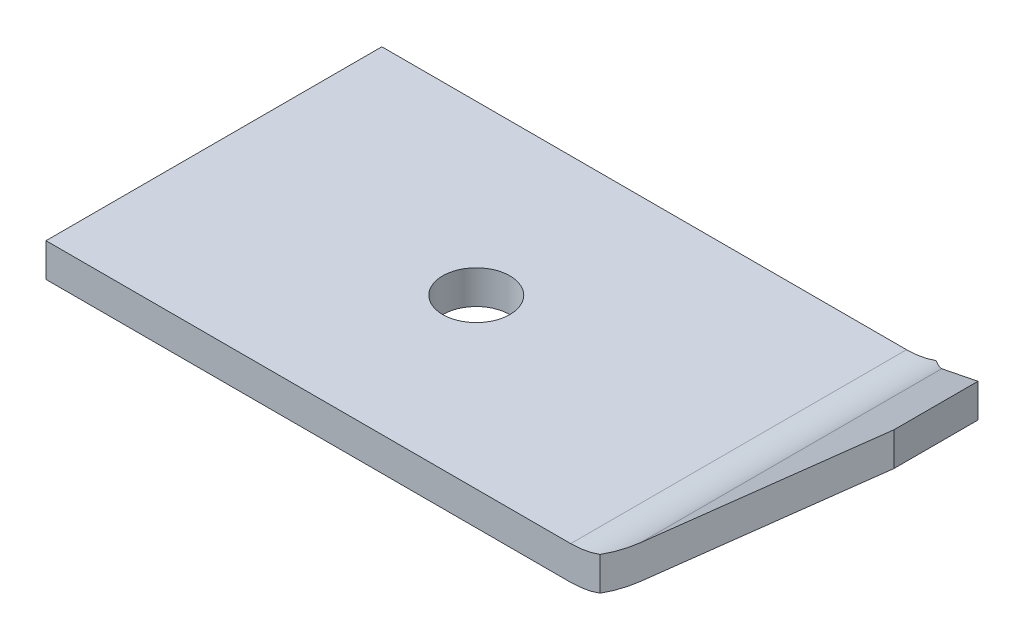
ISO-10303-21;
HEADER;
FILE_DESCRIPTION(('STEP AP214'),'2;1');
FILE_NAME('part.step','',(''),(''),'','','');
FILE_SCHEMA(('AUTOMOTIVE_DESIGN { 1 0 10303 214 1 1 1 1 }'));
ENDSEC;
DATA;
#1=APPLICATION_CONTEXT('core data for automotive mechanical design processes');
#2=APPLICATION_PROTOCOL_DEFINITION('international standard','automotive_design',2000,#1);
#3=PRODUCT_CONTEXT('',#1,'mechanical');
#4=PRODUCT('Part','Part','',(#3));
#5=PRODUCT_RELATED_PRODUCT_CATEGORY('part','',(#4));
#6=PRODUCT_DEFINITION_FORMATION('','',#4);
#7=PRODUCT_DEFINITION_CONTEXT('part definition',#1,'design');
#8=PRODUCT_DEFINITION('design','',#6,#7);
#9=PRODUCT_DEFINITION_SHAPE('','',#8);
#10=(LENGTH_UNIT() NAMED_UNIT(*) SI_UNIT(.MILLI.,.METRE.));
#11=(NAMED_UNIT(*) PLANE_ANGLE_UNIT() SI_UNIT($,.RADIAN.));
#12=(NAMED_UNIT(*) SI_UNIT($,.STERADIAN.) SOLID_ANGLE_UNIT());
#13=UNCERTAINTY_MEASURE_WITH_UNIT(LENGTH_MEASURE(1.E-05),#10,'distance_accuracy_value','');
#14=(GEOMETRIC_REPRESENTATION_CONTEXT(3) GLOBAL_UNCERTAINTY_ASSIGNED_CONTEXT((#13)) GLOBAL_UNIT_ASSIGNED_CONTEXT((#10,
#11,#12)) REPRESENTATION_CONTEXT('',''));
#15=CARTESIAN_POINT('',(0.,0.,0.));
#16=DIRECTION('',(0.,0.,1.));
#17=DIRECTION('',(1.,0.,0.));
#18=AXIS2_PLACEMENT_3D('',#15,#16,#17);
#19=CARTESIAN_POINT('',(16.5,5.,0.));
#20=DIRECTION('',(0.,0.,-1.));
#21=DIRECTION('',(-1.,0.,0.));
#22=AXIS2_PLACEMENT_3D('',#19,#20,#21);
#23=PLANE('',#22);
#24=DIRECTION('',(-1.,0.,0.));
#25=VECTOR('',#24,1.);
#26=CARTESIAN_POINT('',(0.,1.,0.));
#27=LINE('',#26,#25);
#28=CARTESIAN_POINT('',(15.6230473516045,1.,0.));
#29=VERTEX_POINT('',#28);
#30=CARTESIAN_POINT('',(0.,1.,0.));
#31=VERTEX_POINT('',#30);
#32=EDGE_CURVE('E142',#29,#31,#27,.T.);
#33=ORIENTED_EDGE('',*,*,#32,.T.);
#34=DIRECTION('',(0.,-1.,0.));
#35=VECTOR('',#34,1.);
#36=CARTESIAN_POINT('',(0.,5.,0.));
#37=LINE('',#36,#35);
#38=CARTESIAN_POINT('',(0.,0.,0.));
#39=VERTEX_POINT('',#38);
#40=EDGE_CURVE('E154',#31,#39,#37,.T.);
#41=ORIENTED_EDGE('',*,*,#40,.T.);
#42=DIRECTION('',(1.,0.,0.));
#43=VECTOR('',#42,1.);
#44=CARTESIAN_POINT('',(16.5,0.,0.));
#45=LINE('',#44,#43);
#46=CARTESIAN_POINT('',(15.6230473516045,0.,0.));
#47=VERTEX_POINT('',#46);
#48=EDGE_CURVE('E146',#39,#47,#45,.T.);
#49=ORIENTED_EDGE('',*,*,#48,.T.);
#50=CARTESIAN_POINT('',(15.6230473516045,2.5,0.));
#51=DIRECTION('',(0.,0.,1.));
#52=DIRECTION('',(-1.,0.,0.));
#53=AXIS2_PLACEMENT_3D('',#50,#51,#52);
#54=CIRCLE('',#53,2.5);
#55=CARTESIAN_POINT('',(16.5,0.158856251215644,0.));
#56=VERTEX_POINT('',#55);
#57=EDGE_CURVE('E49',#47,#56,#54,.T.);
#58=ORIENTED_EDGE('',*,*,#57,.T.);
#59=DIRECTION('',(0.,-1.,0.));
#60=VECTOR('',#59,1.);
#61=CARTESIAN_POINT('',(16.5,5.,0.));
#62=LINE('',#61,#60);
#63=CARTESIAN_POINT('',(16.5,1.15885625121564,0.));
#64=VERTEX_POINT('',#63);
#65=EDGE_CURVE('E42',#64,#56,#62,.T.);
#66=ORIENTED_EDGE('',*,*,#65,.F.);
#67=CARTESIAN_POINT('',(15.6230473516045,3.5,0.));
#68=DIRECTION('',(0.,0.,-1.));
#69=DIRECTION('',(1.,0.,0.));
#70=AXIS2_PLACEMENT_3D('',#67,#68,#69);
#71=CIRCLE('',#70,2.5);
#72=EDGE_CURVE('E173',#64,#29,#71,.T.);
#73=ORIENTED_EDGE('',*,*,#72,.T.);
#74=EDGE_LOOP('',(#33,#41,#49,#58,#66,#73));
#75=FACE_BOUND('',#74,.T.);
#76=ADVANCED_FACE('F35',(#75),#23,.F.);
#77=CARTESIAN_POINT('',(21.5,5.,-3.75));
#78=DIRECTION('',(-0.6,0.,-0.8));
#79=DIRECTION('',(-0.8,0.,0.6));
#80=AXIS2_PLACEMENT_3D('',#77,#78,#79);
#81=PLANE('',#80);
#82=CARTESIAN_POINT('',(15.6230473516045,3.5,0.657714486296647));
#83=DIRECTION('',(-0.6,0.,-0.8));
#84=DIRECTION('',(-0.8,0.,0.6));
#85=AXIS2_PLACEMENT_3D('',#82,#83,#84);
#86=ELLIPSE('',#85,3.125,2.5);
#87=CARTESIAN_POINT('',(17.1847849704905,1.54782797639243,-0.513588727867904));
#88=VERTEX_POINT('',#87);
#89=EDGE_CURVE('E79',#64,#88,#86,.F.);
#90=ORIENTED_EDGE('',*,*,#89,.F.);
#91=ORIENTED_EDGE('',*,*,#65,.T.);
#92=CARTESIAN_POINT('',(15.6230473516045,2.5,0.657714486296647));
#93=DIRECTION('',(-0.6,0.,-0.8));
#94=DIRECTION('',(-0.8,0.,0.6));
#95=AXIS2_PLACEMENT_3D('',#92,#93,#94);
#96=ELLIPSE('',#95,3.125,2.5);
#97=CARTESIAN_POINT('',(17.1847849704905,0.547827976392431,-0.513588727867904));
#98=VERTEX_POINT('',#97);
#99=EDGE_CURVE('E169',#98,#56,#96,.T.);
#100=ORIENTED_EDGE('',*,*,#99,.F.);
#101=DIRECTION('',(-0.673817120529209,-0.539053696423368,0.505362840396907));
#102=VECTOR('',#101,1.);
#103=CARTESIAN_POINT('',(21.8632236095346,4.2905788876277,-4.02241770715096));
#104=LINE('',#103,#102);
#105=CARTESIAN_POINT('',(21.5,4.,-3.75));
#106=VERTEX_POINT('',#105);
#107=EDGE_CURVE('E150',#106,#98,#104,.T.);
#108=ORIENTED_EDGE('',*,*,#107,.F.);
#109=DIRECTION('',(0.,-1.,0.));
#110=VECTOR('',#109,1.);
#111=CARTESIAN_POINT('',(21.5,5.,-3.75));
#112=LINE('',#111,#110);
#113=CARTESIAN_POINT('',(21.5,5.,-3.75));
#114=VERTEX_POINT('',#113);
#115=EDGE_CURVE('E161',#114,#106,#112,.T.);
#116=ORIENTED_EDGE('',*,*,#115,.F.);
#117=DIRECTION('',(0.673817120529209,0.539053696423368,-0.505362840396907));
#118=VECTOR('',#117,1.);
#119=CARTESIAN_POINT('',(21.5,5.,-3.75));
#120=LINE('',#119,#118);
#121=EDGE_CURVE('E58',#88,#114,#120,.T.);
#122=ORIENTED_EDGE('',*,*,#121,.F.);
#123=EDGE_LOOP('',(#90,#91,#100,#108,#116,#122));
#124=FACE_BOUND('',#123,.T.);
#125=ADVANCED_FACE('F167',(#124),#81,.F.);
#126=CARTESIAN_POINT('',(21.5,5.,-6.25));
#127=DIRECTION('',(-1.,0.,0.));
#128=DIRECTION('',(0.,0.,1.));
#129=AXIS2_PLACEMENT_3D('',#126,#127,#128);
#130=PLANE('',#129);
#131=DIRECTION('',(0.,0.,1.));
#132=VECTOR('',#131,1.);
#133=CARTESIAN_POINT('',(21.5,4.,-10.));
#134=LINE('',#133,#132);
#135=CARTESIAN_POINT('',(21.5,4.,-6.25));
#136=VERTEX_POINT('',#135);
#137=EDGE_CURVE('E191',#136,#106,#134,.T.);
#138=ORIENTED_EDGE('',*,*,#137,.F.);
#139=DIRECTION('',(0.,-1.,0.));
#140=VECTOR('',#139,1.);
#141=CARTESIAN_POINT('',(21.5,5.,-6.25));
#142=LINE('',#141,#140);
#143=CARTESIAN_POINT('',(21.5,5.,-6.25));
#144=VERTEX_POINT('',#143);
#145=EDGE_CURVE('E158',#144,#136,#142,.T.);
#146=ORIENTED_EDGE('',*,*,#145,.F.);
#147=DIRECTION('',(0.,0.,-1.));
#148=VECTOR('',#147,1.);
#149=CARTESIAN_POINT('',(21.5,5.,-6.25));
#150=LINE('',#149,#148);
#151=EDGE_CURVE('E148',#114,#144,#150,.T.);
#152=ORIENTED_EDGE('',*,*,#151,.F.);
#153=ORIENTED_EDGE('',*,*,#115,.T.);
#154=EDGE_LOOP('',(#138,#146,#152,#153));
#155=FACE_BOUND('',#154,.T.);
#156=ADVANCED_FACE('F211',(#155),#130,.F.);
#157=CARTESIAN_POINT('',(16.5,5.,-10.));
#158=DIRECTION('',(-0.600000000000001,0.,0.8));
#159=DIRECTION('',(0.8,0.,0.600000000000001));
#160=AXIS2_PLACEMENT_3D('',#157,#158,#159);
#161=PLANE('',#160);
#162=CARTESIAN_POINT('',(15.6230473516045,3.5,-10.6577144862966));
#163=DIRECTION('',(-0.600000000000001,0.,0.8));
#164=DIRECTION('',(0.8,0.,0.600000000000001));
#165=AXIS2_PLACEMENT_3D('',#162,#163,#164);
#166=ELLIPSE('',#165,3.125,2.5);
#167=CARTESIAN_POINT('',(17.1847849704905,1.54782797639243,-9.4864112721321));
#168=VERTEX_POINT('',#167);
#169=CARTESIAN_POINT('',(16.5,1.15885625121564,-10.));
#170=VERTEX_POINT('',#169);
#171=EDGE_CURVE('E199',#168,#170,#166,.F.);
#172=ORIENTED_EDGE('',*,*,#171,.F.);
#173=DIRECTION('',(-0.673817120529209,-0.539053696423367,-0.505362840396907));
#174=VECTOR('',#173,1.);
#175=CARTESIAN_POINT('',(17.9528944381385,2.16231555051078,-8.91032917139614));
#176=LINE('',#175,#174);
#177=EDGE_CURVE('E83',#144,#168,#176,.T.);
#178=ORIENTED_EDGE('',*,*,#177,.F.);
#179=ORIENTED_EDGE('',*,*,#145,.T.);
#180=DIRECTION('',(0.673817120529209,0.539053696423367,0.505362840396907));
#181=VECTOR('',#180,1.);
#182=CARTESIAN_POINT('',(18.3161180476731,1.45289443813848,-8.63791146424517));
#183=LINE('',#182,#181);
#184=CARTESIAN_POINT('',(17.1847849704905,0.547827976392431,-9.4864112721321));
#185=VERTEX_POINT('',#184);
#186=EDGE_CURVE('E11',#185,#136,#183,.T.);
#187=ORIENTED_EDGE('',*,*,#186,.F.);
#188=CARTESIAN_POINT('',(15.6230473516045,2.5,-10.6577144862966));
#189=DIRECTION('',(-0.600000000000001,0.,0.8));
#190=DIRECTION('',(0.8,0.,0.600000000000001));
#191=AXIS2_PLACEMENT_3D('',#188,#189,#190);
#192=ELLIPSE('',#191,3.125,2.5);
#193=CARTESIAN_POINT('',(16.5,0.158856251215644,-10.));
#194=VERTEX_POINT('',#193);
#195=EDGE_CURVE('E186',#194,#185,#192,.T.);
#196=ORIENTED_EDGE('',*,*,#195,.F.);
#197=DIRECTION('',(0.,-1.,0.));
#198=VECTOR('',#197,1.);
#199=CARTESIAN_POINT('',(16.5,5.,-10.));
#200=LINE('',#199,#198);
#201=EDGE_CURVE('E140',#170,#194,#200,.T.);
#202=ORIENTED_EDGE('',*,*,#201,.F.);
#203=EDGE_LOOP('',(#172,#178,#179,#187,#196,#202));
#204=FACE_BOUND('',#203,.T.);
#205=ADVANCED_FACE('F208',(#204),#161,.F.);
#206=CARTESIAN_POINT('',(0.,5.,-10.));
#207=DIRECTION('',(0.,0.,1.));
#208=DIRECTION('',(1.,0.,0.));
#209=AXIS2_PLACEMENT_3D('',#206,#207,#208);
#210=PLANE('',#209);
#211=DIRECTION('',(-1.,0.,0.));
#212=VECTOR('',#211,1.);
#213=CARTESIAN_POINT('',(0.,1.,-10.));
#214=LINE('',#213,#212);
#215=CARTESIAN_POINT('',(15.6230473516045,1.,-10.));
#216=VERTEX_POINT('',#215);
#217=CARTESIAN_POINT('',(0.,1.,-10.));
#218=VERTEX_POINT('',#217);
#219=EDGE_CURVE('E130',#216,#218,#214,.T.);
#220=ORIENTED_EDGE('',*,*,#219,.F.);
#221=CARTESIAN_POINT('',(15.6230473516045,3.5,-10.));
#222=DIRECTION('',(0.,0.,-1.));
#223=DIRECTION('',(1.,0.,0.));
#224=AXIS2_PLACEMENT_3D('',#221,#222,#223);
#225=CIRCLE('',#224,2.5);
#226=EDGE_CURVE('E141',#170,#216,#225,.T.);
#227=ORIENTED_EDGE('',*,*,#226,.F.);
#228=ORIENTED_EDGE('',*,*,#201,.T.);
#229=CARTESIAN_POINT('',(15.6230473516045,2.5,-10.));
#230=DIRECTION('',(0.,0.,1.));
#231=DIRECTION('',(-1.,0.,0.));
#232=AXIS2_PLACEMENT_3D('',#229,#230,#231);
#233=CIRCLE('',#232,2.5);
#234=CARTESIAN_POINT('',(15.6230473516045,0.,-10.));
#235=VERTEX_POINT('',#234);
#236=EDGE_CURVE('E123',#235,#194,#233,.T.);
#237=ORIENTED_EDGE('',*,*,#236,.F.);
#238=DIRECTION('',(-1.,0.,0.));
#239=VECTOR('',#238,1.);
#240=CARTESIAN_POINT('',(0.,0.,-10.));
#241=LINE('',#240,#239);
#242=CARTESIAN_POINT('',(0.,0.,-10.));
#243=VERTEX_POINT('',#242);
#244=EDGE_CURVE('E136',#235,#243,#241,.T.);
#245=ORIENTED_EDGE('',*,*,#244,.T.);
#246=DIRECTION('',(0.,-1.,0.));
#247=VECTOR('',#246,1.);
#248=CARTESIAN_POINT('',(0.,5.,-10.));
#249=LINE('',#248,#247);
#250=EDGE_CURVE('E71',#218,#243,#249,.T.);
#251=ORIENTED_EDGE('',*,*,#250,.F.);
#252=EDGE_LOOP('',(#220,#227,#228,#237,#245,#251));
#253=FACE_BOUND('',#252,.T.);
#254=ADVANCED_FACE('F135',(#253),#210,.F.);
#255=CARTESIAN_POINT('',(0.,5.,0.));
#256=DIRECTION('',(1.,0.,0.));
#257=DIRECTION('',(0.,0.,-1.));
#258=AXIS2_PLACEMENT_3D('',#255,#256,#257);
#259=PLANE('',#258);
#260=DIRECTION('',(0.,0.,1.));
#261=VECTOR('',#260,1.);
#262=CARTESIAN_POINT('',(0.,1.,-10.));
#263=LINE('',#262,#261);
#264=EDGE_CURVE('E184',#218,#31,#263,.T.);
#265=ORIENTED_EDGE('',*,*,#264,.F.);
#266=ORIENTED_EDGE('',*,*,#250,.T.);
#267=DIRECTION('',(0.,0.,1.));
#268=VECTOR('',#267,1.);
#269=CARTESIAN_POINT('',(0.,0.,0.));
#270=LINE('',#269,#268);
#271=EDGE_CURVE('E145',#243,#39,#270,.T.);
#272=ORIENTED_EDGE('',*,*,#271,.T.);
#273=ORIENTED_EDGE('',*,*,#40,.F.);
#274=EDGE_LOOP('',(#265,#266,#272,#273));
#275=FACE_BOUND('',#274,.T.);
#276=ADVANCED_FACE('F238',(#275),#259,.F.);
#277=CARTESIAN_POINT('',(0.,0.,0.));
#278=DIRECTION('',(0.,-1.,0.));
#279=DIRECTION('',(0.,0.,-1.));
#280=AXIS2_PLACEMENT_3D('',#277,#278,#279);
#281=PLANE('',#280);
#282=CARTESIAN_POINT('',(7.81152367580223,0.,-5.));
#283=DIRECTION('',(0.,1.,0.));
#284=DIRECTION('',(0.,0.,1.));
#285=AXIS2_PLACEMENT_3D('',#282,#283,#284);
#286=CIRCLE('',#285,1.);
#287=CARTESIAN_POINT('',(7.81152367580223,0.,-4.));
#288=VERTEX_POINT('',#287);
#289=EDGE_CURVE('E174',#288,#288,#286,.T.);
#290=ORIENTED_EDGE('',*,*,#289,.T.);
#291=EDGE_LOOP('',(#290));
#292=FACE_BOUND('',#291,.T.);
#293=ORIENTED_EDGE('',*,*,#244,.F.);
#294=DIRECTION('',(0.,0.,1.));
#295=VECTOR('',#294,1.);
#296=CARTESIAN_POINT('',(15.6230473516045,0.,-10.));
#297=LINE('',#296,#295);
#298=EDGE_CURVE('E120',#235,#47,#297,.T.);
#299=ORIENTED_EDGE('',*,*,#298,.T.);
#300=ORIENTED_EDGE('',*,*,#48,.F.);
#301=ORIENTED_EDGE('',*,*,#271,.F.);
#302=EDGE_LOOP('',(#293,#299,#300,#301));
#303=FACE_BOUND('',#302,.T.);
#304=ADVANCED_FACE('F144',(#292,#303),#281,.T.);
#305=CARTESIAN_POINT('',(15.6230473516045,2.5,-10.));
#306=DIRECTION('',(0.,0.,1.));
#307=DIRECTION('',(1.,0.,0.));
#308=AXIS2_PLACEMENT_3D('',#305,#306,#307);
#309=CYLINDRICAL_SURFACE('',#308,2.5);
#310=ORIENTED_EDGE('',*,*,#99,.T.);
#311=ORIENTED_EDGE('',*,*,#57,.F.);
#312=ORIENTED_EDGE('',*,*,#298,.F.);
#313=ORIENTED_EDGE('',*,*,#236,.T.);
#314=ORIENTED_EDGE('',*,*,#195,.T.);
#315=DIRECTION('',(0.,0.,1.));
#316=VECTOR('',#315,1.);
#317=CARTESIAN_POINT('',(17.1847849704905,0.547827976392431,-10.));
#318=LINE('',#317,#316);
#319=EDGE_CURVE('E129',#185,#98,#318,.T.);
#320=ORIENTED_EDGE('',*,*,#319,.T.);
#321=EDGE_LOOP('',(#310,#311,#312,#313,#314,#320));
#322=FACE_BOUND('',#321,.T.);
#323=ADVANCED_FACE('F122',(#322),#309,.T.);
#324=CARTESIAN_POINT('',(21.5,4.,-10.));
#325=DIRECTION('',(0.624695047554425,-0.78086880944303,0.));
#326=DIRECTION('',(0.78086880944303,0.624695047554425,0.));
#327=AXIS2_PLACEMENT_3D('',#324,#325,#326);
#328=PLANE('',#327);
#329=ORIENTED_EDGE('',*,*,#107,.T.);
#330=ORIENTED_EDGE('',*,*,#319,.F.);
#331=ORIENTED_EDGE('',*,*,#186,.T.);
#332=ORIENTED_EDGE('',*,*,#137,.T.);
#333=EDGE_LOOP('',(#329,#330,#331,#332));
#334=FACE_BOUND('',#333,.T.);
#335=ADVANCED_FACE('F213',(#334),#328,.T.);
#336=CARTESIAN_POINT('',(15.6230473516045,3.5,-10.));
#337=DIRECTION('',(0.,0.,1.));
#338=DIRECTION('',(1.,0.,0.));
#339=AXIS2_PLACEMENT_3D('',#336,#337,#338);
#340=CYLINDRICAL_SURFACE('',#339,2.5);
#341=ORIENTED_EDGE('',*,*,#89,.T.);
#342=DIRECTION('',(0.,0.,1.));
#343=VECTOR('',#342,1.);
#344=CARTESIAN_POINT('',(17.1847849704905,1.54782797639243,-10.));
#345=LINE('',#344,#343);
#346=EDGE_CURVE('E189',#168,#88,#345,.T.);
#347=ORIENTED_EDGE('',*,*,#346,.F.);
#348=ORIENTED_EDGE('',*,*,#171,.T.);
#349=ORIENTED_EDGE('',*,*,#226,.T.);
#350=DIRECTION('',(0.,0.,1.));
#351=VECTOR('',#350,1.);
#352=CARTESIAN_POINT('',(15.6230473516045,1.,-10.));
#353=LINE('',#352,#351);
#354=EDGE_CURVE('E187',#216,#29,#353,.T.);
#355=ORIENTED_EDGE('',*,*,#354,.T.);
#356=ORIENTED_EDGE('',*,*,#72,.F.);
#357=EDGE_LOOP('',(#341,#347,#348,#349,#355,#356));
#358=FACE_BOUND('',#357,.T.);
#359=ADVANCED_FACE('F216',(#358),#340,.F.);
#360=CARTESIAN_POINT('',(17.1847849704905,1.54782797639243,-10.));
#361=DIRECTION('',(-0.624695047554425,0.78086880944303,0.));
#362=DIRECTION('',(-0.78086880944303,-0.624695047554425,0.));
#363=AXIS2_PLACEMENT_3D('',#360,#361,#362);
#364=PLANE('',#363);
#365=ORIENTED_EDGE('',*,*,#121,.T.);
#366=ORIENTED_EDGE('',*,*,#151,.T.);
#367=ORIENTED_EDGE('',*,*,#177,.T.);
#368=ORIENTED_EDGE('',*,*,#346,.T.);
#369=EDGE_LOOP('',(#365,#366,#367,#368));
#370=FACE_BOUND('',#369,.T.);
#371=ADVANCED_FACE('F203',(#370),#364,.T.);
#372=CARTESIAN_POINT('',(0.,1.,-10.));
#373=DIRECTION('',(0.,1.,0.));
#374=DIRECTION('',(0.,0.,1.));
#375=AXIS2_PLACEMENT_3D('',#372,#373,#374);
#376=PLANE('',#375);
#377=CARTESIAN_POINT('',(7.81152367580223,1.,-5.));
#378=DIRECTION('',(0.,1.,0.));
#379=DIRECTION('',(0.,0.,1.));
#380=AXIS2_PLACEMENT_3D('',#377,#378,#379);
#381=CIRCLE('',#380,1.);
#382=CARTESIAN_POINT('',(7.81152367580223,1.,-4.));
#383=VERTEX_POINT('',#382);
#384=EDGE_CURVE('E178',#383,#383,#381,.T.);
#385=ORIENTED_EDGE('',*,*,#384,.F.);
#386=EDGE_LOOP('',(#385));
#387=FACE_BOUND('',#386,.T.);
#388=ORIENTED_EDGE('',*,*,#32,.F.);
#389=ORIENTED_EDGE('',*,*,#354,.F.);
#390=ORIENTED_EDGE('',*,*,#219,.T.);
#391=ORIENTED_EDGE('',*,*,#264,.T.);
#392=EDGE_LOOP('',(#388,#389,#390,#391));
#393=FACE_BOUND('',#392,.T.);
#394=ADVANCED_FACE('F250',(#387,#393),#376,.T.);
#395=CARTESIAN_POINT('',(7.81152367580223,0.,-5.));
#396=DIRECTION('',(0.,1.,0.));
#397=DIRECTION('',(0.,0.,1.));
#398=AXIS2_PLACEMENT_3D('',#395,#396,#397);
#399=CYLINDRICAL_SURFACE('',#398,1.);
#400=ORIENTED_EDGE('',*,*,#289,.F.);
#401=EDGE_LOOP('',(#400));
#402=FACE_BOUND('',#401,.T.);
#403=ORIENTED_EDGE('',*,*,#384,.T.);
#404=EDGE_LOOP('',(#403));
#405=FACE_BOUND('',#404,.T.);
#406=ADVANCED_FACE('F247',(#402,#405),#399,.F.);
#407=CLOSED_SHELL('',(#76,#125,#156,#205,#254,#276,#304,#323,#335,#359,#371,#394,#406));
#408=MANIFOLD_SOLID_BREP('B2',#407);
#409=ADVANCED_BREP_SHAPE_REPRESENTATION('',(#18,#408),#14);
#410=SHAPE_DEFINITION_REPRESENTATION(#9,#409);
ENDSEC;
END-ISO-10303-21;
